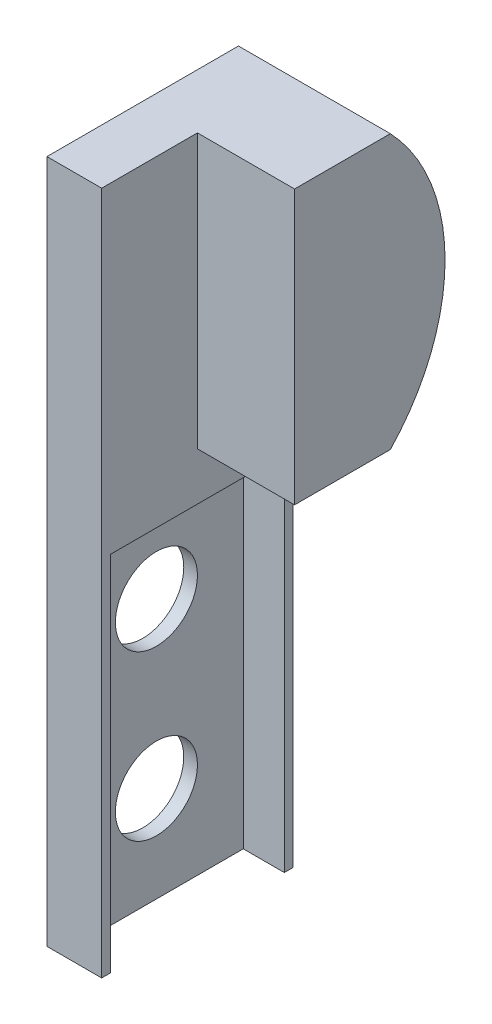
ISO-10303-21;
HEADER;
FILE_DESCRIPTION(('STEP AP214'),'2;1');
FILE_NAME('part.step','',(''),(''),'','','');
FILE_SCHEMA(('AUTOMOTIVE_DESIGN { 1 0 10303 214 1 1 1 1 }'));
ENDSEC;
DATA;
#1=APPLICATION_CONTEXT('core data for automotive mechanical design processes');
#2=APPLICATION_PROTOCOL_DEFINITION('international standard','automotive_design',2000,#1);
#3=PRODUCT_CONTEXT('',#1,'mechanical');
#4=PRODUCT('Part','Part','',(#3));
#5=PRODUCT_RELATED_PRODUCT_CATEGORY('part','',(#4));
#6=PRODUCT_DEFINITION_FORMATION('','',#4);
#7=PRODUCT_DEFINITION_CONTEXT('part definition',#1,'design');
#8=PRODUCT_DEFINITION('design','',#6,#7);
#9=PRODUCT_DEFINITION_SHAPE('','',#8);
#10=(LENGTH_UNIT() NAMED_UNIT(*) SI_UNIT(.MILLI.,.METRE.));
#11=(NAMED_UNIT(*) PLANE_ANGLE_UNIT() SI_UNIT($,.RADIAN.));
#12=(NAMED_UNIT(*) SI_UNIT($,.STERADIAN.) SOLID_ANGLE_UNIT());
#13=UNCERTAINTY_MEASURE_WITH_UNIT(LENGTH_MEASURE(1.E-05),#10,'distance_accuracy_value','');
#14=(GEOMETRIC_REPRESENTATION_CONTEXT(3) GLOBAL_UNCERTAINTY_ASSIGNED_CONTEXT((#13)) GLOBAL_UNIT_ASSIGNED_CONTEXT((#10,
#11,#12)) REPRESENTATION_CONTEXT('',''));
#15=CARTESIAN_POINT('',(0.,0.,0.));
#16=DIRECTION('',(0.,0.,1.));
#17=DIRECTION('',(1.,0.,0.));
#18=AXIS2_PLACEMENT_3D('',#15,#16,#17);
#19=CARTESIAN_POINT('',(4.,0.,0.));
#20=DIRECTION('',(0.,-1.,0.));
#21=DIRECTION('',(0.,0.,-1.));
#22=AXIS2_PLACEMENT_3D('',#19,#20,#21);
#23=PLANE('',#22);
#24=DIRECTION('',(0.,0.,1.));
#25=VECTOR('',#24,1.);
#26=CARTESIAN_POINT('',(0.,0.,0.));
#27=LINE('',#26,#25);
#28=CARTESIAN_POINT('',(0.,0.,0.));
#29=VERTEX_POINT('',#28);
#30=CARTESIAN_POINT('',(0.,0.,14.));
#31=VERTEX_POINT('',#30);
#32=EDGE_CURVE('E211',#29,#31,#27,.T.);
#33=ORIENTED_EDGE('',*,*,#32,.T.);
#34=DIRECTION('',(-1.,0.,0.));
#35=VECTOR('',#34,1.);
#36=CARTESIAN_POINT('',(4.,0.,14.));
#37=LINE('',#36,#35);
#38=CARTESIAN_POINT('',(4.,0.,14.));
#39=VERTEX_POINT('',#38);
#40=EDGE_CURVE('E11',#39,#31,#37,.T.);
#41=ORIENTED_EDGE('',*,*,#40,.F.);
#42=DIRECTION('',(0.,0.,1.));
#43=VECTOR('',#42,1.);
#44=CARTESIAN_POINT('',(4.,0.,0.));
#45=LINE('',#44,#43);
#46=CARTESIAN_POINT('',(4.,0.,7.));
#47=VERTEX_POINT('',#46);
#48=EDGE_CURVE('E221',#47,#39,#45,.T.);
#49=ORIENTED_EDGE('',*,*,#48,.F.);
#50=DIRECTION('',(-1.,0.,0.));
#51=VECTOR('',#50,1.);
#52=CARTESIAN_POINT('',(11.1,0.,7.));
#53=LINE('',#52,#51);
#54=CARTESIAN_POINT('',(11.1,0.,7.));
#55=VERTEX_POINT('',#54);
#56=EDGE_CURVE('E138',#55,#47,#53,.T.);
#57=ORIENTED_EDGE('',*,*,#56,.F.);
#58=DIRECTION('',(0.,0.,1.));
#59=VECTOR('',#58,1.);
#60=CARTESIAN_POINT('',(11.1,0.,0.));
#61=LINE('',#60,#59);
#62=CARTESIAN_POINT('',(11.1,0.,0.));
#63=VERTEX_POINT('',#62);
#64=EDGE_CURVE('E141',#63,#55,#61,.T.);
#65=ORIENTED_EDGE('',*,*,#64,.F.);
#66=DIRECTION('',(-1.,0.,0.));
#67=VECTOR('',#66,1.);
#68=CARTESIAN_POINT('',(11.1,0.,0.));
#69=LINE('',#68,#67);
#70=CARTESIAN_POINT('',(4.,0.,0.));
#71=VERTEX_POINT('',#70);
#72=EDGE_CURVE('E127',#63,#71,#69,.T.);
#73=ORIENTED_EDGE('',*,*,#72,.T.);
#74=DIRECTION('',(-1.,0.,0.));
#75=VECTOR('',#74,1.);
#76=CARTESIAN_POINT('',(4.,0.,0.));
#77=LINE('',#76,#75);
#78=EDGE_CURVE('E237',#71,#29,#77,.T.);
#79=ORIENTED_EDGE('',*,*,#78,.T.);
#80=EDGE_LOOP('',(#33,#41,#49,#57,#65,#73,#79));
#81=FACE_BOUND('',#80,.T.);
#82=ADVANCED_FACE('F41',(#81),#23,.F.);
#83=CARTESIAN_POINT('',(4.,0.,14.));
#84=DIRECTION('',(0.,0.,-1.));
#85=DIRECTION('',(0.,1.,0.));
#86=AXIS2_PLACEMENT_3D('',#83,#84,#85);
#87=PLANE('',#86);
#88=DIRECTION('',(0.,-1.,0.));
#89=VECTOR('',#88,1.);
#90=CARTESIAN_POINT('',(0.,0.,14.));
#91=LINE('',#90,#89);
#92=CARTESIAN_POINT('',(0.,-50.,14.));
#93=VERTEX_POINT('',#92);
#94=EDGE_CURVE('E240',#31,#93,#91,.T.);
#95=ORIENTED_EDGE('',*,*,#94,.T.);
#96=DIRECTION('',(-1.,0.,0.));
#97=VECTOR('',#96,1.);
#98=CARTESIAN_POINT('',(4.,-50.,14.));
#99=LINE('',#98,#97);
#100=CARTESIAN_POINT('',(4.,-50.,14.));
#101=VERTEX_POINT('',#100);
#102=EDGE_CURVE('E49',#101,#93,#99,.T.);
#103=ORIENTED_EDGE('',*,*,#102,.F.);
#104=DIRECTION('',(0.,-1.,0.));
#105=VECTOR('',#104,1.);
#106=CARTESIAN_POINT('',(4.,0.,14.));
#107=LINE('',#106,#105);
#108=EDGE_CURVE('E224',#39,#101,#107,.T.);
#109=ORIENTED_EDGE('',*,*,#108,.F.);
#110=ORIENTED_EDGE('',*,*,#40,.T.);
#111=EDGE_LOOP('',(#95,#103,#109,#110));
#112=FACE_BOUND('',#111,.T.);
#113=ADVANCED_FACE('F265',(#112),#87,.F.);
#114=CARTESIAN_POINT('',(4.,-50.,0.));
#115=DIRECTION('',(0.,-1.,0.));
#116=DIRECTION('',(0.,0.,-1.));
#117=AXIS2_PLACEMENT_3D('',#114,#115,#116);
#118=PLANE('',#117);
#119=DIRECTION('',(-1.,0.,0.));
#120=VECTOR('',#119,1.);
#121=CARTESIAN_POINT('',(4.,-50.,13.35));
#122=LINE('',#121,#120);
#123=CARTESIAN_POINT('',(4.,-50.,13.35));
#124=VERTEX_POINT('',#123);
#125=CARTESIAN_POINT('',(1.,-50.,13.35));
#126=VERTEX_POINT('',#125);
#127=EDGE_CURVE('E137',#124,#126,#122,.T.);
#128=ORIENTED_EDGE('',*,*,#127,.F.);
#129=DIRECTION('',(0.,0.,1.));
#130=VECTOR('',#129,1.);
#131=CARTESIAN_POINT('',(4.,-50.,0.));
#132=LINE('',#131,#130);
#133=EDGE_CURVE('E229',#124,#101,#132,.T.);
#134=ORIENTED_EDGE('',*,*,#133,.T.);
#135=ORIENTED_EDGE('',*,*,#102,.T.);
#136=DIRECTION('',(0.,0.,1.));
#137=VECTOR('',#136,1.);
#138=CARTESIAN_POINT('',(0.,-50.,0.));
#139=LINE('',#138,#137);
#140=CARTESIAN_POINT('',(0.,-50.,0.));
#141=VERTEX_POINT('',#140);
#142=EDGE_CURVE('E244',#141,#93,#139,.T.);
#143=ORIENTED_EDGE('',*,*,#142,.F.);
#144=DIRECTION('',(-1.,0.,0.));
#145=VECTOR('',#144,1.);
#146=CARTESIAN_POINT('',(4.,-50.,0.));
#147=LINE('',#146,#145);
#148=CARTESIAN_POINT('',(4.,-50.,0.));
#149=VERTEX_POINT('',#148);
#150=EDGE_CURVE('E253',#149,#141,#147,.T.);
#151=ORIENTED_EDGE('',*,*,#150,.F.);
#152=CARTESIAN_POINT('',(4.,-50.,0.649999999999991));
#153=VERTEX_POINT('',#152);
#154=EDGE_CURVE('E230',#149,#153,#132,.T.);
#155=ORIENTED_EDGE('',*,*,#154,.T.);
#156=DIRECTION('',(-1.,0.,0.));
#157=VECTOR('',#156,1.);
#158=CARTESIAN_POINT('',(4.,-50.,0.649999999999991));
#159=LINE('',#158,#157);
#160=CARTESIAN_POINT('',(1.,-50.,0.649999999999991));
#161=VERTEX_POINT('',#160);
#162=EDGE_CURVE('E186',#153,#161,#159,.T.);
#163=ORIENTED_EDGE('',*,*,#162,.T.);
#164=DIRECTION('',(0.,0.,-1.));
#165=VECTOR('',#164,1.);
#166=CARTESIAN_POINT('',(1.,-50.,13.35));
#167=LINE('',#166,#165);
#168=EDGE_CURVE('E201',#126,#161,#167,.T.);
#169=ORIENTED_EDGE('',*,*,#168,.F.);
#170=EDGE_LOOP('',(#128,#134,#135,#143,#151,#155,#163,#169));
#171=FACE_BOUND('',#170,.T.);
#172=ADVANCED_FACE('F260',(#171),#118,.T.);
#173=CARTESIAN_POINT('',(4.,0.,0.));
#174=DIRECTION('',(0.,0.,-1.));
#175=DIRECTION('',(0.,1.,0.));
#176=AXIS2_PLACEMENT_3D('',#173,#174,#175);
#177=PLANE('',#176);
#178=DIRECTION('',(0.,-1.,0.));
#179=VECTOR('',#178,1.);
#180=CARTESIAN_POINT('',(0.,0.,0.));
#181=LINE('',#180,#179);
#182=EDGE_CURVE('E225',#29,#141,#181,.T.);
#183=ORIENTED_EDGE('',*,*,#182,.F.);
#184=ORIENTED_EDGE('',*,*,#78,.F.);
#185=DIRECTION('',(0.,-1.,0.));
#186=VECTOR('',#185,1.);
#187=CARTESIAN_POINT('',(4.,0.,0.));
#188=LINE('',#187,#186);
#189=CARTESIAN_POINT('',(4.,-20.,0.));
#190=VERTEX_POINT('',#189);
#191=EDGE_CURVE('E234',#71,#190,#188,.T.);
#192=ORIENTED_EDGE('',*,*,#191,.T.);
#193=EDGE_CURVE('E62',#190,#149,#188,.T.);
#194=ORIENTED_EDGE('',*,*,#193,.T.);
#195=ORIENTED_EDGE('',*,*,#150,.T.);
#196=EDGE_LOOP('',(#183,#184,#192,#194,#195));
#197=FACE_BOUND('',#196,.T.);
#198=ADVANCED_FACE('F272',(#197),#177,.T.);
#199=CARTESIAN_POINT('',(4.,0.,0.));
#200=DIRECTION('',(1.,0.,0.));
#201=DIRECTION('',(0.,0.,-1.));
#202=AXIS2_PLACEMENT_3D('',#199,#200,#201);
#203=PLANE('',#202);
#204=DIRECTION('',(0.,0.,-1.));
#205=VECTOR('',#204,1.);
#206=CARTESIAN_POINT('',(4.,-20.,0.));
#207=LINE('',#206,#205);
#208=CARTESIAN_POINT('',(4.,-20.,7.));
#209=VERTEX_POINT('',#208);
#210=EDGE_CURVE('E154',#209,#190,#207,.T.);
#211=ORIENTED_EDGE('',*,*,#210,.F.);
#212=DIRECTION('',(0.,-1.,0.));
#213=VECTOR('',#212,1.);
#214=CARTESIAN_POINT('',(4.,0.,7.));
#215=LINE('',#214,#213);
#216=EDGE_CURVE('E56',#47,#209,#215,.T.);
#217=ORIENTED_EDGE('',*,*,#216,.F.);
#218=ORIENTED_EDGE('',*,*,#48,.T.);
#219=ORIENTED_EDGE('',*,*,#108,.T.);
#220=ORIENTED_EDGE('',*,*,#133,.F.);
#221=DIRECTION('',(0.,-1.,0.));
#222=VECTOR('',#221,1.);
#223=CARTESIAN_POINT('',(4.,-23.5,13.35));
#224=LINE('',#223,#222);
#225=CARTESIAN_POINT('',(4.,-23.5,13.35));
#226=VERTEX_POINT('',#225);
#227=EDGE_CURVE('E208',#226,#124,#224,.T.);
#228=ORIENTED_EDGE('',*,*,#227,.F.);
#229=DIRECTION('',(0.,0.,-1.));
#230=VECTOR('',#229,1.);
#231=CARTESIAN_POINT('',(4.,-23.5,13.35));
#232=LINE('',#231,#230);
#233=CARTESIAN_POINT('',(4.,-23.5,0.649999999999991));
#234=VERTEX_POINT('',#233);
#235=EDGE_CURVE('E193',#226,#234,#232,.T.);
#236=ORIENTED_EDGE('',*,*,#235,.T.);
#237=DIRECTION('',(0.,-1.,0.));
#238=VECTOR('',#237,1.);
#239=CARTESIAN_POINT('',(4.,-23.5,0.649999999999991));
#240=LINE('',#239,#238);
#241=EDGE_CURVE('E212',#234,#153,#240,.T.);
#242=ORIENTED_EDGE('',*,*,#241,.T.);
#243=ORIENTED_EDGE('',*,*,#154,.F.);
#244=ORIENTED_EDGE('',*,*,#193,.F.);
#245=EDGE_LOOP('',(#211,#217,#218,#219,#220,#228,#236,#242,#243,#244));
#246=FACE_BOUND('',#245,.T.);
#247=ADVANCED_FACE('F274',(#246),#203,.T.);
#248=CARTESIAN_POINT('',(0.,0.,0.));
#249=DIRECTION('',(1.,0.,0.));
#250=DIRECTION('',(0.,0.,-1.));
#251=AXIS2_PLACEMENT_3D('',#248,#249,#250);
#252=PLANE('',#251);
#253=CARTESIAN_POINT('',(0.,-31.,6.99999999999999));
#254=DIRECTION('',(1.,0.,0.));
#255=DIRECTION('',(0.,0.,-1.));
#256=AXIS2_PLACEMENT_3D('',#253,#254,#255);
#257=CIRCLE('',#256,3.);
#258=CARTESIAN_POINT('',(0.,-31.,3.99999999999999));
#259=VERTEX_POINT('',#258);
#260=EDGE_CURVE('E170',#259,#259,#257,.F.);
#261=ORIENTED_EDGE('',*,*,#260,.F.);
#262=EDGE_LOOP('',(#261));
#263=FACE_BOUND('',#262,.T.);
#264=CARTESIAN_POINT('',(0.,-43.,6.99999999999999));
#265=DIRECTION('',(1.,0.,0.));
#266=DIRECTION('',(0.,0.,-1.));
#267=AXIS2_PLACEMENT_3D('',#264,#265,#266);
#268=CIRCLE('',#267,3.);
#269=CARTESIAN_POINT('',(0.,-43.,3.99999999999999));
#270=VERTEX_POINT('',#269);
#271=EDGE_CURVE('E160',#270,#270,#268,.F.);
#272=ORIENTED_EDGE('',*,*,#271,.F.);
#273=EDGE_LOOP('',(#272));
#274=FACE_BOUND('',#273,.T.);
#275=ORIENTED_EDGE('',*,*,#32,.F.);
#276=ORIENTED_EDGE('',*,*,#182,.T.);
#277=ORIENTED_EDGE('',*,*,#142,.T.);
#278=ORIENTED_EDGE('',*,*,#94,.F.);
#279=EDGE_LOOP('',(#275,#276,#277,#278));
#280=FACE_BOUND('',#279,.T.);
#281=ADVANCED_FACE('F269',(#263,#274,#280),#252,.F.);
#282=CARTESIAN_POINT('',(4.,-23.5,13.35));
#283=DIRECTION('',(0.,0.,1.));
#284=DIRECTION('',(1.,0.,0.));
#285=AXIS2_PLACEMENT_3D('',#282,#283,#284);
#286=PLANE('',#285);
#287=ORIENTED_EDGE('',*,*,#127,.T.);
#288=DIRECTION('',(0.,-1.,0.));
#289=VECTOR('',#288,1.);
#290=CARTESIAN_POINT('',(1.,-23.5,13.35));
#291=LINE('',#290,#289);
#292=CARTESIAN_POINT('',(1.,-23.5,13.35));
#293=VERTEX_POINT('',#292);
#294=EDGE_CURVE('E197',#293,#126,#291,.T.);
#295=ORIENTED_EDGE('',*,*,#294,.F.);
#296=DIRECTION('',(-1.,0.,0.));
#297=VECTOR('',#296,1.);
#298=CARTESIAN_POINT('',(4.,-23.5,13.35));
#299=LINE('',#298,#297);
#300=EDGE_CURVE('E181',#226,#293,#299,.T.);
#301=ORIENTED_EDGE('',*,*,#300,.F.);
#302=ORIENTED_EDGE('',*,*,#227,.T.);
#303=EDGE_LOOP('',(#287,#295,#301,#302));
#304=FACE_BOUND('',#303,.T.);
#305=ADVANCED_FACE('F286',(#304),#286,.F.);
#306=CARTESIAN_POINT('',(4.,-23.5,0.649999999999991));
#307=DIRECTION('',(0.,0.,1.));
#308=DIRECTION('',(1.,0.,0.));
#309=AXIS2_PLACEMENT_3D('',#306,#307,#308);
#310=PLANE('',#309);
#311=ORIENTED_EDGE('',*,*,#162,.F.);
#312=ORIENTED_EDGE('',*,*,#241,.F.);
#313=DIRECTION('',(-1.,0.,0.));
#314=VECTOR('',#313,1.);
#315=CARTESIAN_POINT('',(4.,-23.5,0.649999999999991));
#316=LINE('',#315,#314);
#317=CARTESIAN_POINT('',(1.,-23.5,0.649999999999991));
#318=VERTEX_POINT('',#317);
#319=EDGE_CURVE('E190',#234,#318,#316,.T.);
#320=ORIENTED_EDGE('',*,*,#319,.T.);
#321=DIRECTION('',(0.,-1.,0.));
#322=VECTOR('',#321,1.);
#323=CARTESIAN_POINT('',(1.,-23.5,0.649999999999991));
#324=LINE('',#323,#322);
#325=EDGE_CURVE('E216',#318,#161,#324,.T.);
#326=ORIENTED_EDGE('',*,*,#325,.T.);
#327=EDGE_LOOP('',(#311,#312,#320,#326));
#328=FACE_BOUND('',#327,.T.);
#329=ADVANCED_FACE('F278',(#328),#310,.T.);
#330=CARTESIAN_POINT('',(1.,-23.5,13.35));
#331=DIRECTION('',(-1.,0.,0.));
#332=DIRECTION('',(0.,0.,1.));
#333=AXIS2_PLACEMENT_3D('',#330,#331,#332);
#334=PLANE('',#333);
#335=CARTESIAN_POINT('',(1.,-31.,6.99999999999999));
#336=DIRECTION('',(1.,0.,0.));
#337=DIRECTION('',(0.,0.,-1.));
#338=AXIS2_PLACEMENT_3D('',#335,#336,#337);
#339=CIRCLE('',#338,3.);
#340=CARTESIAN_POINT('',(1.,-31.,3.99999999999999));
#341=VERTEX_POINT('',#340);
#342=EDGE_CURVE('E391',#341,#341,#339,.T.);
#343=ORIENTED_EDGE('',*,*,#342,.F.);
#344=EDGE_LOOP('',(#343));
#345=FACE_BOUND('',#344,.T.);
#346=CARTESIAN_POINT('',(1.,-43.,6.99999999999999));
#347=DIRECTION('',(1.,0.,0.));
#348=DIRECTION('',(0.,0.,-1.));
#349=AXIS2_PLACEMENT_3D('',#346,#347,#348);
#350=CIRCLE('',#349,3.);
#351=CARTESIAN_POINT('',(1.,-43.,3.99999999999999));
#352=VERTEX_POINT('',#351);
#353=EDGE_CURVE('E398',#352,#352,#350,.T.);
#354=ORIENTED_EDGE('',*,*,#353,.F.);
#355=EDGE_LOOP('',(#354));
#356=FACE_BOUND('',#355,.T.);
#357=ORIENTED_EDGE('',*,*,#168,.T.);
#358=ORIENTED_EDGE('',*,*,#325,.F.);
#359=DIRECTION('',(0.,0.,-1.));
#360=VECTOR('',#359,1.);
#361=CARTESIAN_POINT('',(1.,-23.5,13.35));
#362=LINE('',#361,#360);
#363=EDGE_CURVE('E185',#293,#318,#362,.T.);
#364=ORIENTED_EDGE('',*,*,#363,.F.);
#365=ORIENTED_EDGE('',*,*,#294,.T.);
#366=EDGE_LOOP('',(#357,#358,#364,#365));
#367=FACE_BOUND('',#366,.T.);
#368=ADVANCED_FACE('F282',(#345,#356,#367),#334,.F.);
#369=CARTESIAN_POINT('',(0.,-23.5,0.));
#370=DIRECTION('',(0.,-1.,0.));
#371=DIRECTION('',(0.,0.,-1.));
#372=AXIS2_PLACEMENT_3D('',#369,#370,#371);
#373=PLANE('',#372);
#374=ORIENTED_EDGE('',*,*,#300,.T.);
#375=ORIENTED_EDGE('',*,*,#363,.T.);
#376=ORIENTED_EDGE('',*,*,#319,.F.);
#377=ORIENTED_EDGE('',*,*,#235,.F.);
#378=EDGE_LOOP('',(#374,#375,#376,#377));
#379=FACE_BOUND('',#378,.T.);
#380=ADVANCED_FACE('F328',(#379),#373,.T.);
#381=CARTESIAN_POINT('',(11.1,-10.,10.5));
#382=DIRECTION('',(-1.,0.,0.));
#383=DIRECTION('',(0.,0.,1.));
#384=AXIS2_PLACEMENT_3D('',#381,#382,#383);
#385=CYLINDRICAL_SURFACE('',#384,14.5);
#386=CARTESIAN_POINT('',(4.,-10.,10.5));
#387=DIRECTION('',(1.,0.,0.));
#388=DIRECTION('',(0.,0.,-1.));
#389=AXIS2_PLACEMENT_3D('',#386,#387,#388);
#390=CIRCLE('',#389,14.5);
#391=EDGE_CURVE('E134',#71,#190,#390,.F.);
#392=ORIENTED_EDGE('',*,*,#391,.F.);
#393=ORIENTED_EDGE('',*,*,#72,.F.);
#394=CARTESIAN_POINT('',(11.1,-10.,10.5));
#395=DIRECTION('',(1.,0.,0.));
#396=DIRECTION('',(0.,0.,-1.));
#397=AXIS2_PLACEMENT_3D('',#394,#395,#396);
#398=CIRCLE('',#397,14.5);
#399=CARTESIAN_POINT('',(11.1,-20.,0.));
#400=VERTEX_POINT('',#399);
#401=EDGE_CURVE('E132',#63,#400,#398,.F.);
#402=ORIENTED_EDGE('',*,*,#401,.T.);
#403=DIRECTION('',(-1.,0.,0.));
#404=VECTOR('',#403,1.);
#405=CARTESIAN_POINT('',(11.1,-20.,0.));
#406=LINE('',#405,#404);
#407=EDGE_CURVE('E167',#400,#190,#406,.T.);
#408=ORIENTED_EDGE('',*,*,#407,.T.);
#409=EDGE_LOOP('',(#392,#393,#402,#408));
#410=FACE_BOUND('',#409,.T.);
#411=ADVANCED_FACE('F129',(#410),#385,.T.);
#412=CARTESIAN_POINT('',(11.1,0.,7.));
#413=DIRECTION('',(0.,0.,-1.));
#414=DIRECTION('',(0.,1.,0.));
#415=AXIS2_PLACEMENT_3D('',#412,#413,#414);
#416=PLANE('',#415);
#417=ORIENTED_EDGE('',*,*,#216,.T.);
#418=DIRECTION('',(-1.,0.,0.));
#419=VECTOR('',#418,1.);
#420=CARTESIAN_POINT('',(11.1,-20.,7.));
#421=LINE('',#420,#419);
#422=CARTESIAN_POINT('',(11.1,-20.,7.));
#423=VERTEX_POINT('',#422);
#424=EDGE_CURVE('E175',#423,#209,#421,.T.);
#425=ORIENTED_EDGE('',*,*,#424,.F.);
#426=DIRECTION('',(0.,-1.,0.));
#427=VECTOR('',#426,1.);
#428=CARTESIAN_POINT('',(11.1,0.,7.));
#429=LINE('',#428,#427);
#430=EDGE_CURVE('E147',#55,#423,#429,.T.);
#431=ORIENTED_EDGE('',*,*,#430,.F.);
#432=ORIENTED_EDGE('',*,*,#56,.T.);
#433=EDGE_LOOP('',(#417,#425,#431,#432));
#434=FACE_BOUND('',#433,.T.);
#435=ADVANCED_FACE('F290',(#434),#416,.F.);
#436=CARTESIAN_POINT('',(11.1,-20.,0.));
#437=DIRECTION('',(0.,1.,0.));
#438=DIRECTION('',(0.,0.,1.));
#439=AXIS2_PLACEMENT_3D('',#436,#437,#438);
#440=PLANE('',#439);
#441=ORIENTED_EDGE('',*,*,#210,.T.);
#442=ORIENTED_EDGE('',*,*,#407,.F.);
#443=DIRECTION('',(0.,0.,-1.));
#444=VECTOR('',#443,1.);
#445=CARTESIAN_POINT('',(11.1,-20.,0.));
#446=LINE('',#445,#444);
#447=EDGE_CURVE('E151',#423,#400,#446,.T.);
#448=ORIENTED_EDGE('',*,*,#447,.F.);
#449=ORIENTED_EDGE('',*,*,#424,.T.);
#450=EDGE_LOOP('',(#441,#442,#448,#449));
#451=FACE_BOUND('',#450,.T.);
#452=ADVANCED_FACE('F293',(#451),#440,.F.);
#453=CARTESIAN_POINT('',(11.1,0.,0.));
#454=DIRECTION('',(1.,0.,0.));
#455=DIRECTION('',(0.,0.,-1.));
#456=AXIS2_PLACEMENT_3D('',#453,#454,#455);
#457=PLANE('',#456);
#458=ORIENTED_EDGE('',*,*,#401,.F.);
#459=ORIENTED_EDGE('',*,*,#64,.T.);
#460=ORIENTED_EDGE('',*,*,#430,.T.);
#461=ORIENTED_EDGE('',*,*,#447,.T.);
#462=EDGE_LOOP('',(#458,#459,#460,#461));
#463=FACE_BOUND('',#462,.T.);
#464=ADVANCED_FACE('F149',(#463),#457,.T.);
#465=CARTESIAN_POINT('',(4.,0.,0.));
#466=DIRECTION('',(1.,0.,0.));
#467=DIRECTION('',(0.,0.,-1.));
#468=AXIS2_PLACEMENT_3D('',#465,#466,#467);
#469=PLANE('',#468);
#470=ORIENTED_EDGE('',*,*,#191,.F.);
#471=ORIENTED_EDGE('',*,*,#391,.T.);
#472=EDGE_LOOP('',(#470,#471));
#473=FACE_BOUND('',#472,.T.);
#474=ADVANCED_FACE('F295',(#473),#469,.F.);
#475=CARTESIAN_POINT('',(-0.000999999999999916,-43.,6.99999999999999));
#476=DIRECTION('',(1.,0.,0.));
#477=DIRECTION('',(0.,0.,-1.));
#478=AXIS2_PLACEMENT_3D('',#475,#476,#477);
#479=CYLINDRICAL_SURFACE('',#478,3.);
#480=ORIENTED_EDGE('',*,*,#353,.T.);
#481=EDGE_LOOP('',(#480));
#482=FACE_BOUND('',#481,.T.);
#483=ORIENTED_EDGE('',*,*,#271,.T.);
#484=EDGE_LOOP('',(#483));
#485=FACE_BOUND('',#484,.T.);
#486=ADVANCED_FACE('F297',(#482,#485),#479,.F.);
#487=CARTESIAN_POINT('',(-0.000999999999999916,-31.,6.99999999999999));
#488=DIRECTION('',(1.,0.,0.));
#489=DIRECTION('',(0.,0.,-1.));
#490=AXIS2_PLACEMENT_3D('',#487,#488,#489);
#491=CYLINDRICAL_SURFACE('',#490,3.);
#492=ORIENTED_EDGE('',*,*,#342,.T.);
#493=EDGE_LOOP('',(#492));
#494=FACE_BOUND('',#493,.T.);
#495=ORIENTED_EDGE('',*,*,#260,.T.);
#496=EDGE_LOOP('',(#495));
#497=FACE_BOUND('',#496,.T.);
#498=ADVANCED_FACE('F303',(#494,#497),#491,.F.);
#499=CLOSED_SHELL('',(#82,#113,#172,#198,#247,#281,#305,#329,#368,#380,#411,#435,#452,#464,#474,
#486,#498));
#500=MANIFOLD_SOLID_BREP('B2',#499);
#501=ADVANCED_BREP_SHAPE_REPRESENTATION('',(#18,#500),#14);
#502=SHAPE_DEFINITION_REPRESENTATION(#9,#501);
ENDSEC;
END-ISO-10303-21;
